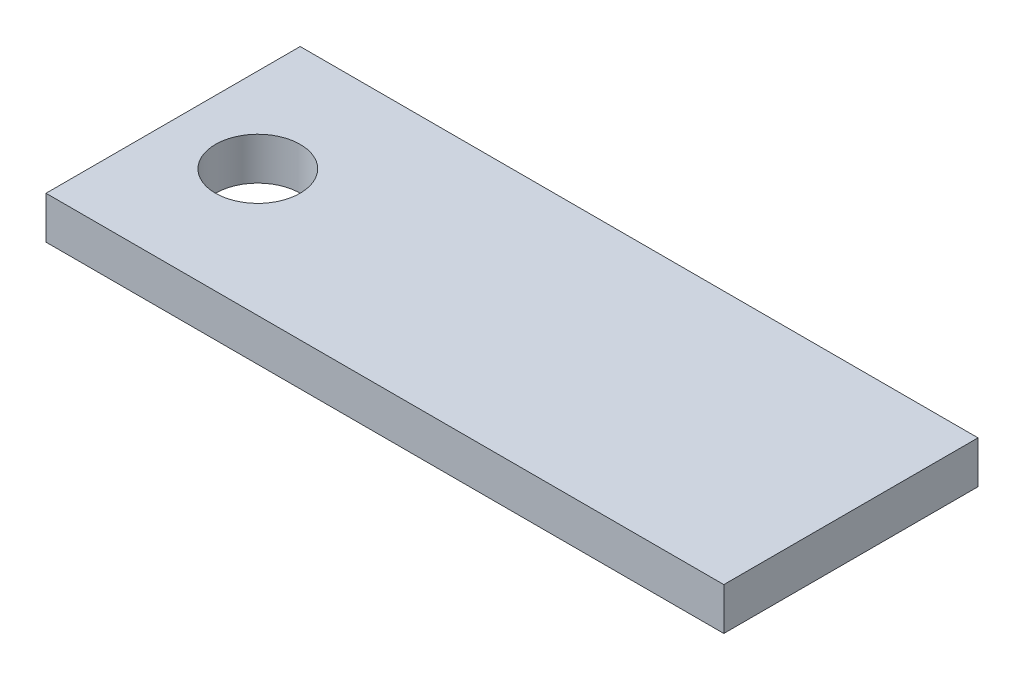
ISO-10303-21;
HEADER;
FILE_DESCRIPTION(('STEP AP214'),'2;1');
FILE_NAME('part.step','',(''),(''),'','','');
FILE_SCHEMA(('AUTOMOTIVE_DESIGN { 1 0 10303 214 1 1 1 1 }'));
ENDSEC;
DATA;
#1=APPLICATION_CONTEXT('core data for automotive mechanical design processes');
#2=APPLICATION_PROTOCOL_DEFINITION('international standard','automotive_design',2000,#1);
#3=PRODUCT_CONTEXT('',#1,'mechanical');
#4=PRODUCT('Part','Part','',(#3));
#5=PRODUCT_RELATED_PRODUCT_CATEGORY('part','',(#4));
#6=PRODUCT_DEFINITION_FORMATION('','',#4);
#7=PRODUCT_DEFINITION_CONTEXT('part definition',#1,'design');
#8=PRODUCT_DEFINITION('design','',#6,#7);
#9=PRODUCT_DEFINITION_SHAPE('','',#8);
#10=(LENGTH_UNIT() NAMED_UNIT(*) SI_UNIT(.MILLI.,.METRE.));
#11=(NAMED_UNIT(*) PLANE_ANGLE_UNIT() SI_UNIT($,.RADIAN.));
#12=(NAMED_UNIT(*) SI_UNIT($,.STERADIAN.) SOLID_ANGLE_UNIT());
#13=UNCERTAINTY_MEASURE_WITH_UNIT(LENGTH_MEASURE(1.E-05),#10,'distance_accuracy_value','');
#14=(GEOMETRIC_REPRESENTATION_CONTEXT(3) GLOBAL_UNCERTAINTY_ASSIGNED_CONTEXT((#13)) GLOBAL_UNIT_ASSIGNED_CONTEXT((#10,
#11,#12)) REPRESENTATION_CONTEXT('',''));
#15=CARTESIAN_POINT('',(0.,0.,0.));
#16=DIRECTION('',(0.,0.,1.));
#17=DIRECTION('',(1.,0.,0.));
#18=AXIS2_PLACEMENT_3D('',#15,#16,#17);
#19=CARTESIAN_POINT('',(50.8,6.35,19.05));
#20=DIRECTION('',(-1.,0.,0.));
#21=DIRECTION('',(0.,0.,1.));
#22=AXIS2_PLACEMENT_3D('',#19,#20,#21);
#23=PLANE('',#22);
#24=DIRECTION('',(0.,0.,-1.));
#25=VECTOR('',#24,1.);
#26=CARTESIAN_POINT('',(50.8,0.,19.05));
#27=LINE('',#26,#25);
#28=CARTESIAN_POINT('',(50.8,0.,19.05));
#29=VERTEX_POINT('',#28);
#30=CARTESIAN_POINT('',(50.8,0.,-19.05));
#31=VERTEX_POINT('',#30);
#32=EDGE_CURVE('E107',#29,#31,#27,.T.);
#33=ORIENTED_EDGE('',*,*,#32,.T.);
#34=DIRECTION('',(0.,-1.,0.));
#35=VECTOR('',#34,1.);
#36=CARTESIAN_POINT('',(50.8,6.35,-19.05));
#37=LINE('',#36,#35);
#38=CARTESIAN_POINT('',(50.8,6.35,-19.05));
#39=VERTEX_POINT('',#38);
#40=EDGE_CURVE('E11',#39,#31,#37,.T.);
#41=ORIENTED_EDGE('',*,*,#40,.F.);
#42=DIRECTION('',(0.,0.,-1.));
#43=VECTOR('',#42,1.);
#44=CARTESIAN_POINT('',(50.8,6.35,19.05));
#45=LINE('',#44,#43);
#46=CARTESIAN_POINT('',(50.8,6.35,19.05));
#47=VERTEX_POINT('',#46);
#48=EDGE_CURVE('E91',#47,#39,#45,.T.);
#49=ORIENTED_EDGE('',*,*,#48,.F.);
#50=DIRECTION('',(0.,-1.,0.));
#51=VECTOR('',#50,1.);
#52=CARTESIAN_POINT('',(50.8,6.35,19.05));
#53=LINE('',#52,#51);
#54=EDGE_CURVE('E103',#47,#29,#53,.T.);
#55=ORIENTED_EDGE('',*,*,#54,.T.);
#56=EDGE_LOOP('',(#33,#41,#49,#55));
#57=FACE_BOUND('',#56,.T.);
#58=ADVANCED_FACE('F39',(#57),#23,.F.);
#59=CARTESIAN_POINT('',(-50.8,6.35,-19.05));
#60=DIRECTION('',(0.,0.,1.));
#61=DIRECTION('',(1.,0.,0.));
#62=AXIS2_PLACEMENT_3D('',#59,#60,#61);
#63=PLANE('',#62);
#64=DIRECTION('',(-1.,0.,0.));
#65=VECTOR('',#64,1.);
#66=CARTESIAN_POINT('',(-50.8,0.,-19.05));
#67=LINE('',#66,#65);
#68=CARTESIAN_POINT('',(-50.8,0.,-19.05));
#69=VERTEX_POINT('',#68);
#70=EDGE_CURVE('E96',#31,#69,#67,.T.);
#71=ORIENTED_EDGE('',*,*,#70,.T.);
#72=DIRECTION('',(0.,-1.,0.));
#73=VECTOR('',#72,1.);
#74=CARTESIAN_POINT('',(-50.8,6.35,-19.05));
#75=LINE('',#74,#73);
#76=CARTESIAN_POINT('',(-50.8,6.35,-19.05));
#77=VERTEX_POINT('',#76);
#78=EDGE_CURVE('E48',#77,#69,#75,.T.);
#79=ORIENTED_EDGE('',*,*,#78,.F.);
#80=DIRECTION('',(-1.,0.,0.));
#81=VECTOR('',#80,1.);
#82=CARTESIAN_POINT('',(-50.8,6.35,-19.05));
#83=LINE('',#82,#81);
#84=EDGE_CURVE('E86',#39,#77,#83,.T.);
#85=ORIENTED_EDGE('',*,*,#84,.F.);
#86=ORIENTED_EDGE('',*,*,#40,.T.);
#87=EDGE_LOOP('',(#71,#79,#85,#86));
#88=FACE_BOUND('',#87,.T.);
#89=ADVANCED_FACE('F95',(#88),#63,.F.);
#90=CARTESIAN_POINT('',(-50.8,6.35,19.05));
#91=DIRECTION('',(1.,0.,0.));
#92=DIRECTION('',(0.,0.,-1.));
#93=AXIS2_PLACEMENT_3D('',#90,#91,#92);
#94=PLANE('',#93);
#95=DIRECTION('',(0.,0.,1.));
#96=VECTOR('',#95,1.);
#97=CARTESIAN_POINT('',(-50.8,0.,19.05));
#98=LINE('',#97,#96);
#99=CARTESIAN_POINT('',(-50.8,0.,19.05));
#100=VERTEX_POINT('',#99);
#101=EDGE_CURVE('E73',#69,#100,#98,.T.);
#102=ORIENTED_EDGE('',*,*,#101,.T.);
#103=DIRECTION('',(0.,-1.,0.));
#104=VECTOR('',#103,1.);
#105=CARTESIAN_POINT('',(-50.8,6.35,19.05));
#106=LINE('',#105,#104);
#107=CARTESIAN_POINT('',(-50.8,6.35,19.05));
#108=VERTEX_POINT('',#107);
#109=EDGE_CURVE('E98',#108,#100,#106,.T.);
#110=ORIENTED_EDGE('',*,*,#109,.F.);
#111=DIRECTION('',(0.,0.,1.));
#112=VECTOR('',#111,1.);
#113=CARTESIAN_POINT('',(-50.8,6.35,19.05));
#114=LINE('',#113,#112);
#115=EDGE_CURVE('E89',#77,#108,#114,.T.);
#116=ORIENTED_EDGE('',*,*,#115,.F.);
#117=ORIENTED_EDGE('',*,*,#78,.T.);
#118=EDGE_LOOP('',(#102,#110,#116,#117));
#119=FACE_BOUND('',#118,.T.);
#120=ADVANCED_FACE('F99',(#119),#94,.F.);
#121=CARTESIAN_POINT('',(-50.8,6.35,19.05));
#122=DIRECTION('',(0.,0.,-1.));
#123=DIRECTION('',(-1.,0.,0.));
#124=AXIS2_PLACEMENT_3D('',#121,#122,#123);
#125=PLANE('',#124);
#126=DIRECTION('',(1.,0.,0.));
#127=VECTOR('',#126,1.);
#128=CARTESIAN_POINT('',(-50.8,0.,19.05));
#129=LINE('',#128,#127);
#130=EDGE_CURVE('E79',#100,#29,#129,.T.);
#131=ORIENTED_EDGE('',*,*,#130,.T.);
#132=ORIENTED_EDGE('',*,*,#54,.F.);
#133=DIRECTION('',(1.,0.,0.));
#134=VECTOR('',#133,1.);
#135=CARTESIAN_POINT('',(-50.8,6.35,19.05));
#136=LINE('',#135,#134);
#137=EDGE_CURVE('E56',#108,#47,#136,.T.);
#138=ORIENTED_EDGE('',*,*,#137,.F.);
#139=ORIENTED_EDGE('',*,*,#109,.T.);
#140=EDGE_LOOP('',(#131,#132,#138,#139));
#141=FACE_BOUND('',#140,.T.);
#142=ADVANCED_FACE('F121',(#141),#125,.F.);
#143=CARTESIAN_POINT('',(0.,6.35,0.));
#144=DIRECTION('',(0.,-1.,0.));
#145=DIRECTION('',(0.,0.,-1.));
#146=AXIS2_PLACEMENT_3D('',#143,#144,#145);
#147=PLANE('',#146);
#148=CARTESIAN_POINT('',(-38.1,6.35,0.));
#149=DIRECTION('',(0.,1.,0.));
#150=DIRECTION('',(0.,0.,1.));
#151=AXIS2_PLACEMENT_3D('',#148,#149,#150);
#152=CIRCLE('',#151,6.35);
#153=CARTESIAN_POINT('',(-38.1,6.35,6.35));
#154=VERTEX_POINT('',#153);
#155=EDGE_CURVE('E128',#154,#154,#152,.T.);
#156=ORIENTED_EDGE('',*,*,#155,.F.);
#157=EDGE_LOOP('',(#156));
#158=FACE_BOUND('',#157,.T.);
#159=ORIENTED_EDGE('',*,*,#48,.T.);
#160=ORIENTED_EDGE('',*,*,#84,.T.);
#161=ORIENTED_EDGE('',*,*,#115,.T.);
#162=ORIENTED_EDGE('',*,*,#137,.T.);
#163=EDGE_LOOP('',(#159,#160,#161,#162));
#164=FACE_BOUND('',#163,.T.);
#165=ADVANCED_FACE('F87',(#158,#164),#147,.F.);
#166=CARTESIAN_POINT('',(0.,0.,0.));
#167=DIRECTION('',(0.,-1.,0.));
#168=DIRECTION('',(0.,0.,-1.));
#169=AXIS2_PLACEMENT_3D('',#166,#167,#168);
#170=PLANE('',#169);
#171=CARTESIAN_POINT('',(-38.1,0.,0.));
#172=DIRECTION('',(0.,1.,0.));
#173=DIRECTION('',(0.,0.,1.));
#174=AXIS2_PLACEMENT_3D('',#171,#172,#173);
#175=CIRCLE('',#174,6.35);
#176=CARTESIAN_POINT('',(-38.1,0.,6.35));
#177=VERTEX_POINT('',#176);
#178=EDGE_CURVE('E111',#177,#177,#175,.T.);
#179=ORIENTED_EDGE('',*,*,#178,.T.);
#180=EDGE_LOOP('',(#179));
#181=FACE_BOUND('',#180,.T.);
#182=ORIENTED_EDGE('',*,*,#32,.F.);
#183=ORIENTED_EDGE('',*,*,#130,.F.);
#184=ORIENTED_EDGE('',*,*,#101,.F.);
#185=ORIENTED_EDGE('',*,*,#70,.F.);
#186=EDGE_LOOP('',(#182,#183,#184,#185));
#187=FACE_BOUND('',#186,.T.);
#188=ADVANCED_FACE('F124',(#181,#187),#170,.T.);
#189=CARTESIAN_POINT('',(-38.1,0.,0.));
#190=DIRECTION('',(0.,1.,0.));
#191=DIRECTION('',(0.,0.,1.));
#192=AXIS2_PLACEMENT_3D('',#189,#190,#191);
#193=CYLINDRICAL_SURFACE('',#192,6.35);
#194=ORIENTED_EDGE('',*,*,#178,.F.);
#195=EDGE_LOOP('',(#194));
#196=FACE_BOUND('',#195,.T.);
#197=ORIENTED_EDGE('',*,*,#155,.T.);
#198=EDGE_LOOP('',(#197));
#199=FACE_BOUND('',#198,.T.);
#200=ADVANCED_FACE('F137',(#196,#199),#193,.F.);
#201=CLOSED_SHELL('',(#58,#89,#120,#142,#165,#188,#200));
#202=MANIFOLD_SOLID_BREP('B2',#201);
#203=ADVANCED_BREP_SHAPE_REPRESENTATION('',(#18,#202),#14);
#204=SHAPE_DEFINITION_REPRESENTATION(#9,#203);
ENDSEC;
END-ISO-10303-21;
